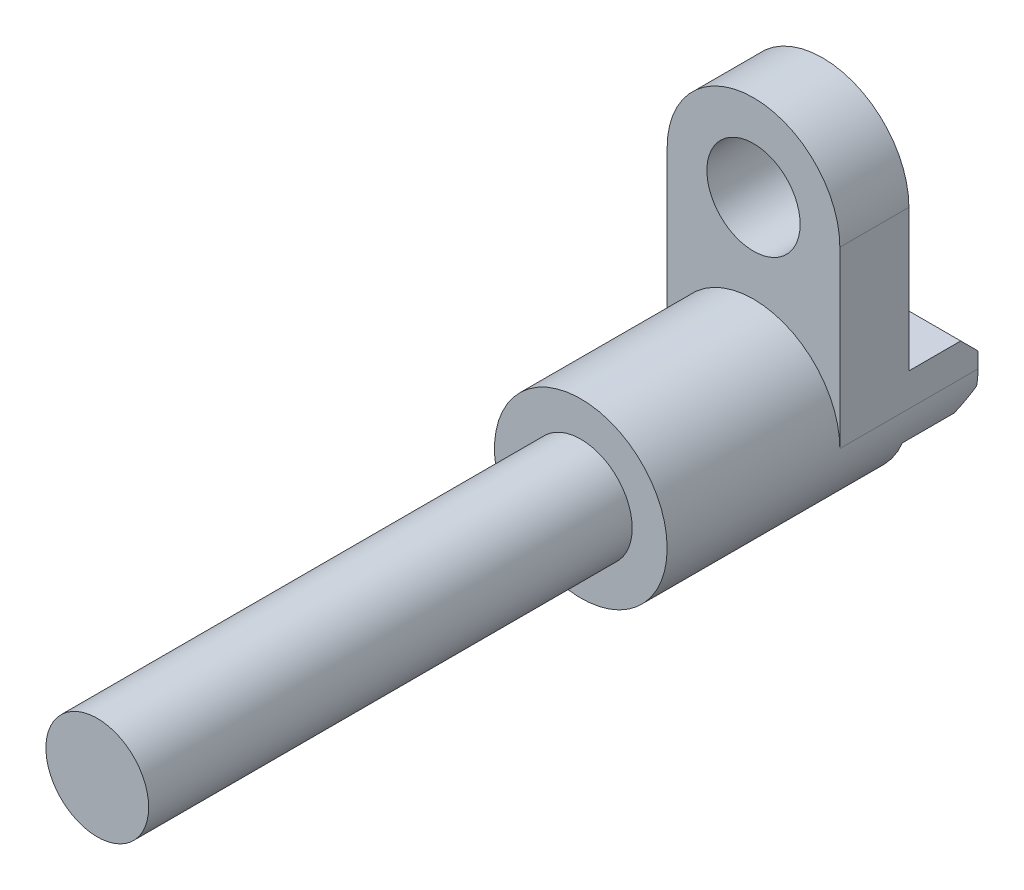
ISO-10303-21;
HEADER;
FILE_DESCRIPTION(('STEP AP214'),'2;1');
FILE_NAME('part.step','',(''),(''),'','','');
FILE_SCHEMA(('AUTOMOTIVE_DESIGN { 1 0 10303 214 1 1 1 1 }'));
ENDSEC;
DATA;
#1=APPLICATION_CONTEXT('core data for automotive mechanical design processes');
#2=APPLICATION_PROTOCOL_DEFINITION('international standard','automotive_design',2000,#1);
#3=PRODUCT_CONTEXT('',#1,'mechanical');
#4=PRODUCT('Part','Part','',(#3));
#5=PRODUCT_RELATED_PRODUCT_CATEGORY('part','',(#4));
#6=PRODUCT_DEFINITION_FORMATION('','',#4);
#7=PRODUCT_DEFINITION_CONTEXT('part definition',#1,'design');
#8=PRODUCT_DEFINITION('design','',#6,#7);
#9=PRODUCT_DEFINITION_SHAPE('','',#8);
#10=(LENGTH_UNIT() NAMED_UNIT(*) SI_UNIT(.MILLI.,.METRE.));
#11=(NAMED_UNIT(*) PLANE_ANGLE_UNIT() SI_UNIT($,.RADIAN.));
#12=(NAMED_UNIT(*) SI_UNIT($,.STERADIAN.) SOLID_ANGLE_UNIT());
#13=UNCERTAINTY_MEASURE_WITH_UNIT(LENGTH_MEASURE(1.E-05),#10,'distance_accuracy_value','');
#14=(GEOMETRIC_REPRESENTATION_CONTEXT(3) GLOBAL_UNCERTAINTY_ASSIGNED_CONTEXT((#13)) GLOBAL_UNIT_ASSIGNED_CONTEXT((#10,
#11,#12)) REPRESENTATION_CONTEXT('',''));
#15=CARTESIAN_POINT('',(0.,0.,0.));
#16=DIRECTION('',(0.,0.,1.));
#17=DIRECTION('',(1.,0.,0.));
#18=AXIS2_PLACEMENT_3D('',#15,#16,#17);
#19=CARTESIAN_POINT('',(0.,0.,0.));
#20=DIRECTION('',(0.,0.,1.));
#21=DIRECTION('',(1.,0.,0.));
#22=AXIS2_PLACEMENT_3D('',#19,#20,#21);
#23=PLANE('',#22);
#24=CARTESIAN_POINT('',(0.,5.05,0.));
#25=DIRECTION('',(0.,0.,1.));
#26=DIRECTION('',(1.,0.,0.));
#27=AXIS2_PLACEMENT_3D('',#24,#25,#26);
#28=CIRCLE('',#27,1.35);
#29=CARTESIAN_POINT('',(1.35,5.05,0.));
#30=VERTEX_POINT('',#29);
#31=EDGE_CURVE('E186',#30,#30,#28,.T.);
#32=ORIENTED_EDGE('',*,*,#31,.T.);
#33=EDGE_LOOP('',(#32));
#34=FACE_BOUND('',#33,.T.);
#35=DIRECTION('',(1.,0.,0.));
#36=VECTOR('',#35,1.);
#37=CARTESIAN_POINT('',(2.5,0.95,0.));
#38=LINE('',#37,#36);
#39=CARTESIAN_POINT('',(-2.5,0.95,0.));
#40=VERTEX_POINT('',#39);
#41=CARTESIAN_POINT('',(2.5,0.95,0.));
#42=VERTEX_POINT('',#41);
#43=EDGE_CURVE('E157',#40,#42,#38,.T.);
#44=ORIENTED_EDGE('',*,*,#43,.F.);
#45=DIRECTION('',(0.,-1.,0.));
#46=VECTOR('',#45,1.);
#47=CARTESIAN_POINT('',(-2.5,5.05,0.));
#48=LINE('',#47,#46);
#49=CARTESIAN_POINT('',(-2.5,5.05,0.));
#50=VERTEX_POINT('',#49);
#51=EDGE_CURVE('E201',#50,#40,#48,.T.);
#52=ORIENTED_EDGE('',*,*,#51,.F.);
#53=CARTESIAN_POINT('',(0.,5.05,0.));
#54=DIRECTION('',(0.,0.,1.));
#55=DIRECTION('',(1.,0.,0.));
#56=AXIS2_PLACEMENT_3D('',#53,#54,#55);
#57=CIRCLE('',#56,2.5);
#58=CARTESIAN_POINT('',(2.5,5.05,0.));
#59=VERTEX_POINT('',#58);
#60=EDGE_CURVE('E212',#59,#50,#57,.T.);
#61=ORIENTED_EDGE('',*,*,#60,.F.);
#62=DIRECTION('',(0.,1.,0.));
#63=VECTOR('',#62,1.);
#64=CARTESIAN_POINT('',(2.5,5.05,0.));
#65=LINE('',#64,#63);
#66=EDGE_CURVE('E209',#42,#59,#65,.T.);
#67=ORIENTED_EDGE('',*,*,#66,.F.);
#68=EDGE_LOOP('',(#44,#52,#61,#67));
#69=FACE_BOUND('',#68,.T.);
#70=ADVANCED_FACE('F39',(#34,#69),#23,.F.);
#71=DIRECTION('',(-1.,0.,0.));
#72=VECTOR('',#71,1.);
#73=CARTESIAN_POINT('',(2.31246621596944,-0.95,0.));
#74=LINE('',#73,#72);
#75=CARTESIAN_POINT('',(2.31246621596944,-0.95,0.));
#76=VERTEX_POINT('',#75);
#77=CARTESIAN_POINT('',(-2.31246621596944,-0.950000000000001,0.));
#78=VERTEX_POINT('',#77);
#79=EDGE_CURVE('E153',#76,#78,#74,.T.);
#80=ORIENTED_EDGE('',*,*,#79,.F.);
#81=CARTESIAN_POINT('',(0.,0.,0.));
#82=DIRECTION('',(0.,0.,1.));
#83=DIRECTION('',(1.,0.,0.));
#84=AXIS2_PLACEMENT_3D('',#81,#82,#83);
#85=CIRCLE('',#84,2.5);
#86=EDGE_CURVE('E193',#78,#76,#85,.T.);
#87=ORIENTED_EDGE('',*,*,#86,.F.);
#88=EDGE_LOOP('',(#80,#87));
#89=FACE_BOUND('',#88,.T.);
#90=ADVANCED_FACE('F255',(#89),#23,.F.);
#91=CARTESIAN_POINT('',(0.,0.,2.));
#92=DIRECTION('',(0.,0.,1.));
#93=DIRECTION('',(1.,0.,0.));
#94=AXIS2_PLACEMENT_3D('',#91,#92,#93);
#95=PLANE('',#94);
#96=CARTESIAN_POINT('',(0.,0.,2.));
#97=DIRECTION('',(0.,0.,1.));
#98=DIRECTION('',(1.,0.,0.));
#99=AXIS2_PLACEMENT_3D('',#96,#97,#98);
#100=CIRCLE('',#99,2.5);
#101=CARTESIAN_POINT('',(2.5,0.,2.));
#102=VERTEX_POINT('',#101);
#103=CARTESIAN_POINT('',(-2.5,0.,2.));
#104=VERTEX_POINT('',#103);
#105=EDGE_CURVE('E136',#102,#104,#100,.T.);
#106=ORIENTED_EDGE('',*,*,#105,.F.);
#107=DIRECTION('',(0.,1.,0.));
#108=VECTOR('',#107,1.);
#109=CARTESIAN_POINT('',(2.5,5.05,2.));
#110=LINE('',#109,#108);
#111=CARTESIAN_POINT('',(2.5,5.05,2.));
#112=VERTEX_POINT('',#111);
#113=EDGE_CURVE('E197',#102,#112,#110,.T.);
#114=ORIENTED_EDGE('',*,*,#113,.T.);
#115=CARTESIAN_POINT('',(0.,5.05,2.));
#116=DIRECTION('',(0.,0.,1.));
#117=DIRECTION('',(1.,0.,0.));
#118=AXIS2_PLACEMENT_3D('',#115,#116,#117);
#119=CIRCLE('',#118,2.5);
#120=CARTESIAN_POINT('',(-2.5,5.05,2.));
#121=VERTEX_POINT('',#120);
#122=EDGE_CURVE('E200',#112,#121,#119,.T.);
#123=ORIENTED_EDGE('',*,*,#122,.T.);
#124=DIRECTION('',(0.,-1.,0.));
#125=VECTOR('',#124,1.);
#126=CARTESIAN_POINT('',(-2.5,5.05,2.));
#127=LINE('',#126,#125);
#128=EDGE_CURVE('E141',#121,#104,#127,.T.);
#129=ORIENTED_EDGE('',*,*,#128,.T.);
#130=EDGE_LOOP('',(#106,#114,#123,#129));
#131=FACE_BOUND('',#130,.T.);
#132=CARTESIAN_POINT('',(0.,5.05,2.));
#133=DIRECTION('',(0.,0.,1.));
#134=DIRECTION('',(1.,0.,0.));
#135=AXIS2_PLACEMENT_3D('',#132,#133,#134);
#136=CIRCLE('',#135,1.35);
#137=CARTESIAN_POINT('',(1.35,5.05,2.));
#138=VERTEX_POINT('',#137);
#139=EDGE_CURVE('E189',#138,#138,#136,.T.);
#140=ORIENTED_EDGE('',*,*,#139,.F.);
#141=EDGE_LOOP('',(#140));
#142=FACE_BOUND('',#141,.T.);
#143=ADVANCED_FACE('F257',(#131,#142),#95,.T.);
#144=CARTESIAN_POINT('',(0.,0.,2.));
#145=DIRECTION('',(0.,0.,-1.));
#146=DIRECTION('',(-1.,0.,0.));
#147=AXIS2_PLACEMENT_3D('',#144,#145,#146);
#148=CYLINDRICAL_SURFACE('',#147,2.5);
#149=CARTESIAN_POINT('',(0.,0.,-2.));
#150=DIRECTION('',(0.,0.,-1.));
#151=DIRECTION('',(-1.,0.,0.));
#152=AXIS2_PLACEMENT_3D('',#149,#150,#151);
#153=CIRCLE('',#152,2.5);
#154=CARTESIAN_POINT('',(-2.45916652547159,-0.45,-2.));
#155=VERTEX_POINT('',#154);
#156=CARTESIAN_POINT('',(-2.5,0.,-2.));
#157=VERTEX_POINT('',#156);
#158=EDGE_CURVE('E116',#155,#157,#153,.T.);
#159=ORIENTED_EDGE('',*,*,#158,.F.);
#160=CARTESIAN_POINT('',(0.,0.,-2.45));
#161=DIRECTION('',(0.,-0.707106781186547,-0.707106781186547));
#162=DIRECTION('',(0.,0.707106781186548,-0.707106781186548));
#163=AXIS2_PLACEMENT_3D('',#160,#161,#162);
#164=ELLIPSE('',#163,3.53553390593274,2.5);
#165=CARTESIAN_POINT('',(-2.31246621596944,-0.950000000000001,-1.5));
#166=VERTEX_POINT('',#165);
#167=EDGE_CURVE('E235',#155,#166,#164,.F.);
#168=ORIENTED_EDGE('',*,*,#167,.T.);
#169=DIRECTION('',(0.,0.,1.));
#170=VECTOR('',#169,1.);
#171=CARTESIAN_POINT('',(-2.31246621596944,-0.950000000000001,-2.));
#172=LINE('',#171,#170);
#173=EDGE_CURVE('E166',#166,#78,#172,.T.);
#174=ORIENTED_EDGE('',*,*,#173,.T.);
#175=ORIENTED_EDGE('',*,*,#86,.T.);
#176=DIRECTION('',(0.,0.,1.));
#177=VECTOR('',#176,1.);
#178=CARTESIAN_POINT('',(2.31246621596944,-0.95,-2.));
#179=LINE('',#178,#177);
#180=CARTESIAN_POINT('',(2.31246621596944,-0.95,-1.5));
#181=VERTEX_POINT('',#180);
#182=EDGE_CURVE('E169',#181,#76,#179,.T.);
#183=ORIENTED_EDGE('',*,*,#182,.F.);
#184=CARTESIAN_POINT('',(0.,0.,-2.45));
#185=DIRECTION('',(0.,-0.707106781186547,-0.707106781186547));
#186=DIRECTION('',(0.,0.707106781186548,-0.707106781186548));
#187=AXIS2_PLACEMENT_3D('',#184,#185,#186);
#188=ELLIPSE('',#187,3.53553390593274,2.5);
#189=CARTESIAN_POINT('',(2.45916652547159,-0.45,-2.));
#190=VERTEX_POINT('',#189);
#191=EDGE_CURVE('E232',#181,#190,#188,.F.);
#192=ORIENTED_EDGE('',*,*,#191,.T.);
#193=CARTESIAN_POINT('',(0.,0.,-2.));
#194=DIRECTION('',(0.,0.,-1.));
#195=DIRECTION('',(-1.,0.,0.));
#196=AXIS2_PLACEMENT_3D('',#193,#194,#195);
#197=CIRCLE('',#196,2.5);
#198=CARTESIAN_POINT('',(2.5,0.,-2.));
#199=VERTEX_POINT('',#198);
#200=EDGE_CURVE('E128',#199,#190,#197,.T.);
#201=ORIENTED_EDGE('',*,*,#200,.F.);
#202=DIRECTION('',(0.,0.,-1.));
#203=VECTOR('',#202,1.);
#204=CARTESIAN_POINT('',(2.5,0.,2.));
#205=LINE('',#204,#203);
#206=EDGE_CURVE('E181',#102,#199,#205,.T.);
#207=ORIENTED_EDGE('',*,*,#206,.F.);
#208=ORIENTED_EDGE('',*,*,#105,.T.);
#209=DIRECTION('',(0.,0.,-1.));
#210=VECTOR('',#209,1.);
#211=CARTESIAN_POINT('',(-2.5,0.,2.));
#212=LINE('',#211,#210);
#213=EDGE_CURVE('E132',#104,#157,#212,.T.);
#214=ORIENTED_EDGE('',*,*,#213,.T.);
#215=EDGE_LOOP('',(#159,#168,#174,#175,#183,#192,#201,#207,#208,#214));
#216=FACE_BOUND('',#215,.T.);
#217=CARTESIAN_POINT('',(0.,0.,7.));
#218=DIRECTION('',(0.,0.,1.));
#219=DIRECTION('',(1.,0.,0.));
#220=AXIS2_PLACEMENT_3D('',#217,#218,#219);
#221=CIRCLE('',#220,2.5);
#222=CARTESIAN_POINT('',(2.5,0.,7.));
#223=VERTEX_POINT('',#222);
#224=EDGE_CURVE('E182',#223,#223,#221,.T.);
#225=ORIENTED_EDGE('',*,*,#224,.F.);
#226=EDGE_LOOP('',(#225));
#227=FACE_BOUND('',#226,.T.);
#228=ADVANCED_FACE('F133',(#216,#227),#148,.T.);
#229=CARTESIAN_POINT('',(2.5,5.05,2.));
#230=DIRECTION('',(-1.,0.,0.));
#231=DIRECTION('',(0.,-1.,0.));
#232=AXIS2_PLACEMENT_3D('',#229,#230,#231);
#233=PLANE('',#232);
#234=DIRECTION('',(0.,-1.,0.));
#235=VECTOR('',#234,1.);
#236=CARTESIAN_POINT('',(2.5,0.,-2.));
#237=LINE('',#236,#235);
#238=CARTESIAN_POINT('',(2.5,0.449999999999999,-2.));
#239=VERTEX_POINT('',#238);
#240=EDGE_CURVE('E146',#239,#199,#237,.T.);
#241=ORIENTED_EDGE('',*,*,#240,.F.);
#242=DIRECTION('',(0.,0.707106781186548,0.707106781186548));
#243=VECTOR('',#242,1.);
#244=CARTESIAN_POINT('',(2.5,0.449999999999999,-2.));
#245=LINE('',#244,#243);
#246=CARTESIAN_POINT('',(2.5,0.95,-1.5));
#247=VERTEX_POINT('',#246);
#248=EDGE_CURVE('E62',#239,#247,#245,.T.);
#249=ORIENTED_EDGE('',*,*,#248,.T.);
#250=DIRECTION('',(0.,0.,1.));
#251=VECTOR('',#250,1.);
#252=CARTESIAN_POINT('',(2.5,0.95,-2.));
#253=LINE('',#252,#251);
#254=EDGE_CURVE('E149',#247,#42,#253,.T.);
#255=ORIENTED_EDGE('',*,*,#254,.T.);
#256=ORIENTED_EDGE('',*,*,#66,.T.);
#257=DIRECTION('',(0.,0.,-1.));
#258=VECTOR('',#257,1.);
#259=CARTESIAN_POINT('',(2.5,5.05,2.));
#260=LINE('',#259,#258);
#261=EDGE_CURVE('E221',#112,#59,#260,.T.);
#262=ORIENTED_EDGE('',*,*,#261,.F.);
#263=ORIENTED_EDGE('',*,*,#113,.F.);
#264=ORIENTED_EDGE('',*,*,#206,.T.);
#265=EDGE_LOOP('',(#241,#249,#255,#256,#262,#263,#264));
#266=FACE_BOUND('',#265,.T.);
#267=ADVANCED_FACE('F274',(#266),#233,.F.);
#268=CARTESIAN_POINT('',(0.,5.05,2.));
#269=DIRECTION('',(0.,0.,-1.));
#270=DIRECTION('',(-1.,0.,0.));
#271=AXIS2_PLACEMENT_3D('',#268,#269,#270);
#272=CYLINDRICAL_SURFACE('',#271,2.5);
#273=ORIENTED_EDGE('',*,*,#60,.T.);
#274=DIRECTION('',(0.,0.,-1.));
#275=VECTOR('',#274,1.);
#276=CARTESIAN_POINT('',(-2.5,5.05,2.));
#277=LINE('',#276,#275);
#278=EDGE_CURVE('E140',#121,#50,#277,.T.);
#279=ORIENTED_EDGE('',*,*,#278,.F.);
#280=ORIENTED_EDGE('',*,*,#122,.F.);
#281=ORIENTED_EDGE('',*,*,#261,.T.);
#282=EDGE_LOOP('',(#273,#279,#280,#281));
#283=FACE_BOUND('',#282,.T.);
#284=ADVANCED_FACE('F271',(#283),#272,.T.);
#285=CARTESIAN_POINT('',(-2.5,5.05,2.));
#286=DIRECTION('',(1.,0.,0.));
#287=DIRECTION('',(0.,1.,0.));
#288=AXIS2_PLACEMENT_3D('',#285,#286,#287);
#289=PLANE('',#288);
#290=DIRECTION('',(0.,0.,1.));
#291=VECTOR('',#290,1.);
#292=CARTESIAN_POINT('',(-2.5,0.95,-2.));
#293=LINE('',#292,#291);
#294=CARTESIAN_POINT('',(-2.5,0.95,-1.5));
#295=VERTEX_POINT('',#294);
#296=EDGE_CURVE('E163',#295,#40,#293,.T.);
#297=ORIENTED_EDGE('',*,*,#296,.F.);
#298=DIRECTION('',(0.,-0.707106781186548,-0.707106781186548));
#299=VECTOR('',#298,1.);
#300=CARTESIAN_POINT('',(-2.5,0.45,-2.));
#301=LINE('',#300,#299);
#302=CARTESIAN_POINT('',(-2.5,0.45,-2.));
#303=VERTEX_POINT('',#302);
#304=EDGE_CURVE('E11',#295,#303,#301,.T.);
#305=ORIENTED_EDGE('',*,*,#304,.T.);
#306=DIRECTION('',(0.,1.,0.));
#307=VECTOR('',#306,1.);
#308=CARTESIAN_POINT('',(-2.5,0.95,-2.));
#309=LINE('',#308,#307);
#310=EDGE_CURVE('E122',#157,#303,#309,.T.);
#311=ORIENTED_EDGE('',*,*,#310,.F.);
#312=ORIENTED_EDGE('',*,*,#213,.F.);
#313=ORIENTED_EDGE('',*,*,#128,.F.);
#314=ORIENTED_EDGE('',*,*,#278,.T.);
#315=ORIENTED_EDGE('',*,*,#51,.T.);
#316=EDGE_LOOP('',(#297,#305,#311,#312,#313,#314,#315));
#317=FACE_BOUND('',#316,.T.);
#318=ADVANCED_FACE('F143',(#317),#289,.F.);
#319=CARTESIAN_POINT('',(0.,5.05,2.));
#320=DIRECTION('',(0.,0.,-1.));
#321=DIRECTION('',(-1.,0.,0.));
#322=AXIS2_PLACEMENT_3D('',#319,#320,#321);
#323=CYLINDRICAL_SURFACE('',#322,1.35);
#324=ORIENTED_EDGE('',*,*,#139,.T.);
#325=EDGE_LOOP('',(#324));
#326=FACE_BOUND('',#325,.T.);
#327=ORIENTED_EDGE('',*,*,#31,.F.);
#328=EDGE_LOOP('',(#327));
#329=FACE_BOUND('',#328,.T.);
#330=ADVANCED_FACE('F270',(#326,#329),#323,.F.);
#331=CARTESIAN_POINT('',(0.,0.,7.));
#332=DIRECTION('',(0.,0.,1.));
#333=DIRECTION('',(1.,0.,0.));
#334=AXIS2_PLACEMENT_3D('',#331,#332,#333);
#335=PLANE('',#334);
#336=CARTESIAN_POINT('',(0.,0.,7.));
#337=DIRECTION('',(0.,0.,1.));
#338=DIRECTION('',(1.,0.,0.));
#339=AXIS2_PLACEMENT_3D('',#336,#337,#338);
#340=CIRCLE('',#339,1.4875);
#341=CARTESIAN_POINT('',(1.4875,0.,7.));
#342=VERTEX_POINT('',#341);
#343=EDGE_CURVE('E176',#342,#342,#340,.T.);
#344=ORIENTED_EDGE('',*,*,#343,.F.);
#345=EDGE_LOOP('',(#344));
#346=FACE_BOUND('',#345,.T.);
#347=ORIENTED_EDGE('',*,*,#224,.T.);
#348=EDGE_LOOP('',(#347));
#349=FACE_BOUND('',#348,.T.);
#350=ADVANCED_FACE('F301',(#346,#349),#335,.T.);
#351=CARTESIAN_POINT('',(0.,0.,21.));
#352=DIRECTION('',(0.,0.,-1.));
#353=DIRECTION('',(-1.,0.,0.));
#354=AXIS2_PLACEMENT_3D('',#351,#352,#353);
#355=CYLINDRICAL_SURFACE('',#354,1.4875);
#356=CARTESIAN_POINT('',(0.,0.,21.));
#357=DIRECTION('',(0.,0.,1.));
#358=DIRECTION('',(1.,0.,0.));
#359=AXIS2_PLACEMENT_3D('',#356,#357,#358);
#360=CIRCLE('',#359,1.4875);
#361=CARTESIAN_POINT('',(1.4875,0.,21.));
#362=VERTEX_POINT('',#361);
#363=EDGE_CURVE('E172',#362,#362,#360,.T.);
#364=ORIENTED_EDGE('',*,*,#363,.F.);
#365=EDGE_LOOP('',(#364));
#366=FACE_BOUND('',#365,.T.);
#367=ORIENTED_EDGE('',*,*,#343,.T.);
#368=EDGE_LOOP('',(#367));
#369=FACE_BOUND('',#368,.T.);
#370=ADVANCED_FACE('F297',(#366,#369),#355,.T.);
#371=CARTESIAN_POINT('',(0.,0.,21.));
#372=DIRECTION('',(0.,0.,1.));
#373=DIRECTION('',(1.,0.,0.));
#374=AXIS2_PLACEMENT_3D('',#371,#372,#373);
#375=PLANE('',#374);
#376=ORIENTED_EDGE('',*,*,#363,.T.);
#377=EDGE_LOOP('',(#376));
#378=FACE_BOUND('',#377,.T.);
#379=ADVANCED_FACE('F294',(#378),#375,.T.);
#380=CARTESIAN_POINT('',(2.31246621596944,-0.95,-2.));
#381=DIRECTION('',(0.,1.,0.));
#382=DIRECTION('',(0.,0.,1.));
#383=AXIS2_PLACEMENT_3D('',#380,#381,#382);
#384=PLANE('',#383);
#385=ORIENTED_EDGE('',*,*,#173,.F.);
#386=DIRECTION('',(1.,0.,0.));
#387=VECTOR('',#386,1.);
#388=CARTESIAN_POINT('',(2.31246621596944,-0.95,-1.5));
#389=LINE('',#388,#387);
#390=EDGE_CURVE('E238',#166,#181,#389,.T.);
#391=ORIENTED_EDGE('',*,*,#390,.T.);
#392=ORIENTED_EDGE('',*,*,#182,.T.);
#393=ORIENTED_EDGE('',*,*,#79,.T.);
#394=EDGE_LOOP('',(#385,#391,#392,#393));
#395=FACE_BOUND('',#394,.T.);
#396=ADVANCED_FACE('F247',(#395),#384,.F.);
#397=CARTESIAN_POINT('',(2.5,0.95,-2.));
#398=DIRECTION('',(0.,-1.,0.));
#399=DIRECTION('',(1.,0.,0.));
#400=AXIS2_PLACEMENT_3D('',#397,#398,#399);
#401=PLANE('',#400);
#402=ORIENTED_EDGE('',*,*,#254,.F.);
#403=DIRECTION('',(-1.,0.,0.));
#404=VECTOR('',#403,1.);
#405=CARTESIAN_POINT('',(-2.5,0.95,-1.5));
#406=LINE('',#405,#404);
#407=EDGE_CURVE('E48',#247,#295,#406,.T.);
#408=ORIENTED_EDGE('',*,*,#407,.T.);
#409=ORIENTED_EDGE('',*,*,#296,.T.);
#410=ORIENTED_EDGE('',*,*,#43,.T.);
#411=EDGE_LOOP('',(#402,#408,#409,#410));
#412=FACE_BOUND('',#411,.T.);
#413=ADVANCED_FACE('F285',(#412),#401,.F.);
#414=CARTESIAN_POINT('',(0.,0.,-2.));
#415=DIRECTION('',(0.,0.,-1.));
#416=DIRECTION('',(-1.,0.,0.));
#417=AXIS2_PLACEMENT_3D('',#414,#415,#416);
#418=PLANE('',#417);
#419=ORIENTED_EDGE('',*,*,#200,.T.);
#420=DIRECTION('',(-1.,0.,0.));
#421=VECTOR('',#420,1.);
#422=CARTESIAN_POINT('',(-2.31246621596944,-0.45,-2.));
#423=LINE('',#422,#421);
#424=EDGE_CURVE('E125',#190,#155,#423,.T.);
#425=ORIENTED_EDGE('',*,*,#424,.T.);
#426=ORIENTED_EDGE('',*,*,#158,.T.);
#427=ORIENTED_EDGE('',*,*,#310,.T.);
#428=DIRECTION('',(1.,0.,0.));
#429=VECTOR('',#428,1.);
#430=CARTESIAN_POINT('',(2.5,0.45,-2.));
#431=LINE('',#430,#429);
#432=EDGE_CURVE('E180',#303,#239,#431,.T.);
#433=ORIENTED_EDGE('',*,*,#432,.T.);
#434=ORIENTED_EDGE('',*,*,#240,.T.);
#435=EDGE_LOOP('',(#419,#425,#426,#427,#433,#434));
#436=FACE_BOUND('',#435,.T.);
#437=ADVANCED_FACE('F119',(#436),#418,.T.);
#438=CARTESIAN_POINT('',(0.,-0.45,-2.));
#439=DIRECTION('',(0.,-0.707106781186547,-0.707106781186547));
#440=DIRECTION('',(1.,0.,0.));
#441=AXIS2_PLACEMENT_3D('',#438,#439,#440);
#442=PLANE('',#441);
#443=ORIENTED_EDGE('',*,*,#191,.F.);
#444=ORIENTED_EDGE('',*,*,#390,.F.);
#445=ORIENTED_EDGE('',*,*,#167,.F.);
#446=ORIENTED_EDGE('',*,*,#424,.F.);
#447=EDGE_LOOP('',(#443,#444,#445,#446));
#448=FACE_BOUND('',#447,.T.);
#449=ADVANCED_FACE('F253',(#448),#442,.T.);
#450=CARTESIAN_POINT('',(0.,0.45,-2.));
#451=DIRECTION('',(0.,0.707106781186547,-0.707106781186547));
#452=DIRECTION('',(-1.,0.,0.));
#453=AXIS2_PLACEMENT_3D('',#450,#451,#452);
#454=PLANE('',#453);
#455=ORIENTED_EDGE('',*,*,#304,.F.);
#456=ORIENTED_EDGE('',*,*,#407,.F.);
#457=ORIENTED_EDGE('',*,*,#248,.F.);
#458=ORIENTED_EDGE('',*,*,#432,.F.);
#459=EDGE_LOOP('',(#455,#456,#457,#458));
#460=FACE_BOUND('',#459,.T.);
#461=ADVANCED_FACE('F41',(#460),#454,.T.);
#462=CLOSED_SHELL('',(#70,#90,#143,#228,#267,#284,#318,#330,#350,#370,#379,#396,#413,#437,#449,#461));
#463=MANIFOLD_SOLID_BREP('B2',#462);
#464=ADVANCED_BREP_SHAPE_REPRESENTATION('',(#18,#463),#14);
#465=SHAPE_DEFINITION_REPRESENTATION(#9,#464);
ENDSEC;
END-ISO-10303-21;
